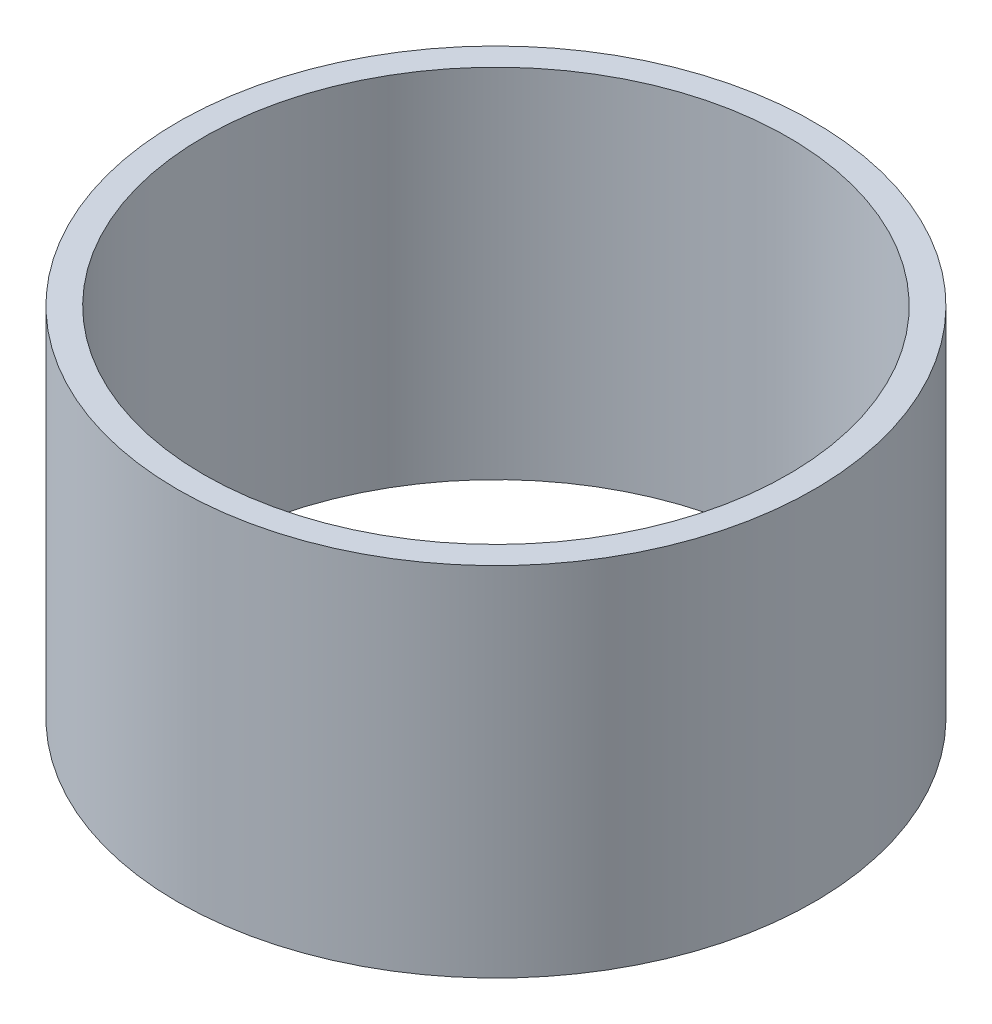
ISO-10303-21;
HEADER;
FILE_DESCRIPTION(('STEP AP214'),'2;1');
FILE_NAME('part.step','',(''),(''),'','','');
FILE_SCHEMA(('AUTOMOTIVE_DESIGN { 1 0 10303 214 1 1 1 1 }'));
ENDSEC;
DATA;
#1=APPLICATION_CONTEXT('core data for automotive mechanical design processes');
#2=APPLICATION_PROTOCOL_DEFINITION('international standard','automotive_design',2000,#1);
#3=PRODUCT_CONTEXT('',#1,'mechanical');
#4=PRODUCT('Part','Part','',(#3));
#5=PRODUCT_RELATED_PRODUCT_CATEGORY('part','',(#4));
#6=PRODUCT_DEFINITION_FORMATION('','',#4);
#7=PRODUCT_DEFINITION_CONTEXT('part definition',#1,'design');
#8=PRODUCT_DEFINITION('design','',#6,#7);
#9=PRODUCT_DEFINITION_SHAPE('','',#8);
#10=(LENGTH_UNIT() NAMED_UNIT(*) SI_UNIT(.MILLI.,.METRE.));
#11=(NAMED_UNIT(*) PLANE_ANGLE_UNIT() SI_UNIT($,.RADIAN.));
#12=(NAMED_UNIT(*) SI_UNIT($,.STERADIAN.) SOLID_ANGLE_UNIT());
#13=UNCERTAINTY_MEASURE_WITH_UNIT(LENGTH_MEASURE(1.E-05),#10,'distance_accuracy_value','');
#14=(GEOMETRIC_REPRESENTATION_CONTEXT(3) GLOBAL_UNCERTAINTY_ASSIGNED_CONTEXT((#13)) GLOBAL_UNIT_ASSIGNED_CONTEXT((#10,
#11,#12)) REPRESENTATION_CONTEXT('',''));
#15=CARTESIAN_POINT('',(0.,0.,0.));
#16=DIRECTION('',(0.,0.,1.));
#17=DIRECTION('',(1.,0.,0.));
#18=AXIS2_PLACEMENT_3D('',#15,#16,#17);
#19=CARTESIAN_POINT('',(0.,55.,0.));
#20=DIRECTION('',(0.,1.,0.));
#21=DIRECTION('',(0.,0.,1.));
#22=AXIS2_PLACEMENT_3D('',#19,#20,#21);
#23=PLANE('',#22);
#24=CARTESIAN_POINT('',(0.,55.,0.));
#25=DIRECTION('',(0.,1.,0.));
#26=DIRECTION('',(0.,0.,1.));
#27=AXIS2_PLACEMENT_3D('',#24,#25,#26);
#28=CIRCLE('',#27,49.);
#29=CARTESIAN_POINT('',(0.,55.,49.));
#30=VERTEX_POINT('',#29);
#31=EDGE_CURVE('E10',#30,#30,#28,.T.);
#32=ORIENTED_EDGE('',*,*,#31,.T.);
#33=EDGE_LOOP('',(#32));
#34=FACE_BOUND('',#33,.T.);
#35=CARTESIAN_POINT('',(0.,55.,0.));
#36=DIRECTION('',(0.,1.,0.));
#37=DIRECTION('',(0.,0.,1.));
#38=AXIS2_PLACEMENT_3D('',#35,#36,#37);
#39=CIRCLE('',#38,45.);
#40=CARTESIAN_POINT('',(0.,55.,45.));
#41=VERTEX_POINT('',#40);
#42=EDGE_CURVE('E42',#41,#41,#39,.T.);
#43=ORIENTED_EDGE('',*,*,#42,.F.);
#44=EDGE_LOOP('',(#43));
#45=FACE_BOUND('',#44,.T.);
#46=ADVANCED_FACE('F31',(#34,#45),#23,.T.);
#47=CARTESIAN_POINT('',(0.,0.,0.));
#48=DIRECTION('',(0.,1.,0.));
#49=DIRECTION('',(0.,0.,1.));
#50=AXIS2_PLACEMENT_3D('',#47,#48,#49);
#51=PLANE('',#50);
#52=CARTESIAN_POINT('',(0.,0.,0.));
#53=DIRECTION('',(0.,1.,0.));
#54=DIRECTION('',(0.,0.,1.));
#55=AXIS2_PLACEMENT_3D('',#52,#53,#54);
#56=CIRCLE('',#55,49.);
#57=CARTESIAN_POINT('',(0.,0.,49.));
#58=VERTEX_POINT('',#57);
#59=EDGE_CURVE('E35',#58,#58,#56,.T.);
#60=ORIENTED_EDGE('',*,*,#59,.F.);
#61=EDGE_LOOP('',(#60));
#62=FACE_BOUND('',#61,.T.);
#63=CARTESIAN_POINT('',(0.,0.,0.));
#64=DIRECTION('',(0.,1.,0.));
#65=DIRECTION('',(0.,0.,1.));
#66=AXIS2_PLACEMENT_3D('',#63,#64,#65);
#67=CIRCLE('',#66,45.);
#68=CARTESIAN_POINT('',(0.,0.,45.));
#69=VERTEX_POINT('',#68);
#70=EDGE_CURVE('E44',#69,#69,#67,.T.);
#71=ORIENTED_EDGE('',*,*,#70,.T.);
#72=EDGE_LOOP('',(#71));
#73=FACE_BOUND('',#72,.T.);
#74=ADVANCED_FACE('F54',(#62,#73),#51,.F.);
#75=CARTESIAN_POINT('',(0.,55.,0.));
#76=DIRECTION('',(0.,-1.,0.));
#77=DIRECTION('',(0.,0.,-1.));
#78=AXIS2_PLACEMENT_3D('',#75,#76,#77);
#79=CYLINDRICAL_SURFACE('',#78,49.);
#80=ORIENTED_EDGE('',*,*,#31,.F.);
#81=EDGE_LOOP('',(#80));
#82=FACE_BOUND('',#81,.T.);
#83=ORIENTED_EDGE('',*,*,#59,.T.);
#84=EDGE_LOOP('',(#83));
#85=FACE_BOUND('',#84,.T.);
#86=ADVANCED_FACE('F33',(#82,#85),#79,.T.);
#87=CARTESIAN_POINT('',(0.,55.,0.));
#88=DIRECTION('',(0.,-1.,0.));
#89=DIRECTION('',(0.,0.,-1.));
#90=AXIS2_PLACEMENT_3D('',#87,#88,#89);
#91=CYLINDRICAL_SURFACE('',#90,45.);
#92=ORIENTED_EDGE('',*,*,#42,.T.);
#93=EDGE_LOOP('',(#92));
#94=FACE_BOUND('',#93,.T.);
#95=ORIENTED_EDGE('',*,*,#70,.F.);
#96=EDGE_LOOP('',(#95));
#97=FACE_BOUND('',#96,.T.);
#98=ADVANCED_FACE('F50',(#94,#97),#91,.F.);
#99=CLOSED_SHELL('',(#46,#74,#86,#98));
#100=MANIFOLD_SOLID_BREP('B2',#99);
#101=ADVANCED_BREP_SHAPE_REPRESENTATION('',(#18,#100),#14);
#102=SHAPE_DEFINITION_REPRESENTATION(#9,#101);
ENDSEC;
END-ISO-10303-21;
